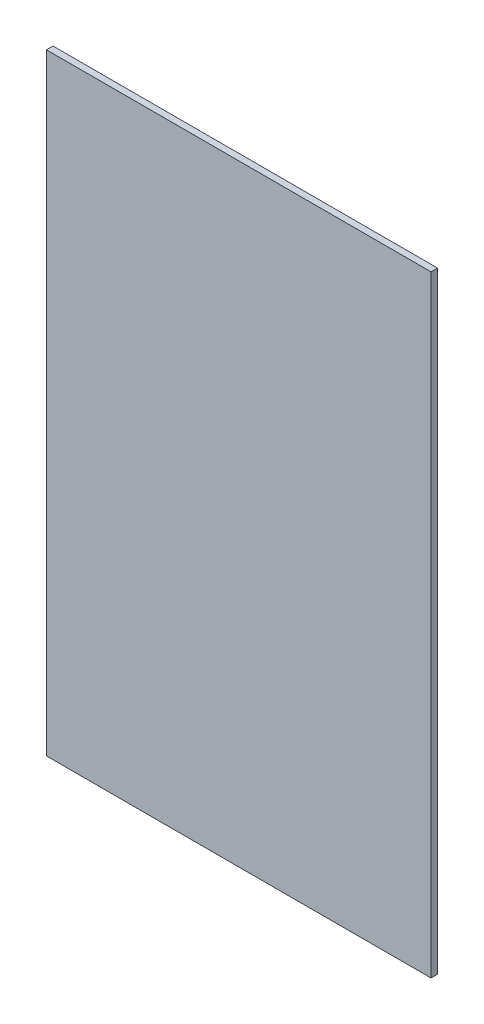
ISO-10303-21;
HEADER;
FILE_DESCRIPTION(('STEP AP214'),'2;1');
FILE_NAME('part.step','',(''),(''),'','','');
FILE_SCHEMA(('AUTOMOTIVE_DESIGN { 1 0 10303 214 1 1 1 1 }'));
ENDSEC;
DATA;
#1=APPLICATION_CONTEXT('core data for automotive mechanical design processes');
#2=APPLICATION_PROTOCOL_DEFINITION('international standard','automotive_design',2000,#1);
#3=PRODUCT_CONTEXT('',#1,'mechanical');
#4=PRODUCT('Part','Part','',(#3));
#5=PRODUCT_RELATED_PRODUCT_CATEGORY('part','',(#4));
#6=PRODUCT_DEFINITION_FORMATION('','',#4);
#7=PRODUCT_DEFINITION_CONTEXT('part definition',#1,'design');
#8=PRODUCT_DEFINITION('design','',#6,#7);
#9=PRODUCT_DEFINITION_SHAPE('','',#8);
#10=(LENGTH_UNIT() NAMED_UNIT(*) SI_UNIT(.MILLI.,.METRE.));
#11=(NAMED_UNIT(*) PLANE_ANGLE_UNIT() SI_UNIT($,.RADIAN.));
#12=(NAMED_UNIT(*) SI_UNIT($,.STERADIAN.) SOLID_ANGLE_UNIT());
#13=UNCERTAINTY_MEASURE_WITH_UNIT(LENGTH_MEASURE(1.E-05),#10,'distance_accuracy_value','');
#14=(GEOMETRIC_REPRESENTATION_CONTEXT(3) GLOBAL_UNCERTAINTY_ASSIGNED_CONTEXT((#13)) GLOBAL_UNIT_ASSIGNED_CONTEXT((#10,
#11,#12)) REPRESENTATION_CONTEXT('',''));
#15=CARTESIAN_POINT('',(0.,0.,0.));
#16=DIRECTION('',(0.,0.,1.));
#17=DIRECTION('',(1.,0.,0.));
#18=AXIS2_PLACEMENT_3D('',#15,#16,#17);
#19=CARTESIAN_POINT('',(-99.899186737332,-60.7822000000056,2.54));
#20=DIRECTION('',(1.,0.,0.));
#21=DIRECTION('',(0.,1.,0.));
#22=AXIS2_PLACEMENT_3D('',#19,#20,#21);
#23=PLANE('',#22);
#24=DIRECTION('',(0.,-1.,0.));
#25=VECTOR('',#24,1.);
#26=CARTESIAN_POINT('',(-99.899186737332,-60.7822000000056,0.));
#27=LINE('',#26,#25);
#28=CARTESIAN_POINT('',(-99.899186737332,-60.7822000000056,0.));
#29=VERTEX_POINT('',#28);
#30=CARTESIAN_POINT('',(-99.899186737332,-297.865800000011,0.));
#31=VERTEX_POINT('',#30);
#32=EDGE_CURVE('E102',#29,#31,#27,.T.);
#33=ORIENTED_EDGE('',*,*,#32,.T.);
#34=DIRECTION('',(0.,0.,-1.));
#35=VECTOR('',#34,1.);
#36=CARTESIAN_POINT('',(-99.899186737332,-297.865800000011,2.54));
#37=LINE('',#36,#35);
#38=CARTESIAN_POINT('',(-99.899186737332,-297.865800000011,2.54));
#39=VERTEX_POINT('',#38);
#40=EDGE_CURVE('E11',#39,#31,#37,.T.);
#41=ORIENTED_EDGE('',*,*,#40,.F.);
#42=DIRECTION('',(0.,-1.,0.));
#43=VECTOR('',#42,1.);
#44=CARTESIAN_POINT('',(-99.899186737332,-60.7822000000056,2.54));
#45=LINE('',#44,#43);
#46=CARTESIAN_POINT('',(-99.899186737332,-60.7822000000056,2.54));
#47=VERTEX_POINT('',#46);
#48=EDGE_CURVE('E90',#47,#39,#45,.T.);
#49=ORIENTED_EDGE('',*,*,#48,.F.);
#50=DIRECTION('',(0.,0.,-1.));
#51=VECTOR('',#50,1.);
#52=CARTESIAN_POINT('',(-99.899186737332,-60.7822000000056,2.54));
#53=LINE('',#52,#51);
#54=EDGE_CURVE('E98',#47,#29,#53,.T.);
#55=ORIENTED_EDGE('',*,*,#54,.T.);
#56=EDGE_LOOP('',(#33,#41,#49,#55));
#57=FACE_BOUND('',#56,.T.);
#58=ADVANCED_FACE('F39',(#57),#23,.F.);
#59=CARTESIAN_POINT('',(-99.899186737332,-297.865800000011,2.54));
#60=DIRECTION('',(0.,1.,0.));
#61=DIRECTION('',(0.,0.,1.));
#62=AXIS2_PLACEMENT_3D('',#59,#60,#61);
#63=PLANE('',#62);
#64=DIRECTION('',(1.,0.,0.));
#65=VECTOR('',#64,1.);
#66=CARTESIAN_POINT('',(-99.899186737332,-297.865800000011,0.));
#67=LINE('',#66,#65);
#68=CARTESIAN_POINT('',(49.2125000000101,-297.865800000011,0.));
#69=VERTEX_POINT('',#68);
#70=EDGE_CURVE('E94',#31,#69,#67,.T.);
#71=ORIENTED_EDGE('',*,*,#70,.T.);
#72=DIRECTION('',(0.,0.,-1.));
#73=VECTOR('',#72,1.);
#74=CARTESIAN_POINT('',(49.2125000000101,-297.865800000011,2.54));
#75=LINE('',#74,#73);
#76=CARTESIAN_POINT('',(49.2125000000101,-297.865800000011,2.54));
#77=VERTEX_POINT('',#76);
#78=EDGE_CURVE('E47',#77,#69,#75,.T.);
#79=ORIENTED_EDGE('',*,*,#78,.F.);
#80=DIRECTION('',(1.,0.,0.));
#81=VECTOR('',#80,1.);
#82=CARTESIAN_POINT('',(-99.899186737332,-297.865800000011,2.54));
#83=LINE('',#82,#81);
#84=EDGE_CURVE('E85',#39,#77,#83,.T.);
#85=ORIENTED_EDGE('',*,*,#84,.F.);
#86=ORIENTED_EDGE('',*,*,#40,.T.);
#87=EDGE_LOOP('',(#71,#79,#85,#86));
#88=FACE_BOUND('',#87,.T.);
#89=ADVANCED_FACE('F93',(#88),#63,.F.);
#90=CARTESIAN_POINT('',(49.2125000000101,-60.7822000000056,2.54));
#91=DIRECTION('',(-1.,0.,0.));
#92=DIRECTION('',(0.,-1.,0.));
#93=AXIS2_PLACEMENT_3D('',#90,#91,#92);
#94=PLANE('',#93);
#95=DIRECTION('',(0.,1.,0.));
#96=VECTOR('',#95,1.);
#97=CARTESIAN_POINT('',(49.2125000000101,-60.7822000000056,0.));
#98=LINE('',#97,#96);
#99=CARTESIAN_POINT('',(49.2125000000101,-60.7822000000056,0.));
#100=VERTEX_POINT('',#99);
#101=EDGE_CURVE('E72',#69,#100,#98,.T.);
#102=ORIENTED_EDGE('',*,*,#101,.T.);
#103=DIRECTION('',(0.,0.,-1.));
#104=VECTOR('',#103,1.);
#105=CARTESIAN_POINT('',(49.2125000000101,-60.7822000000056,2.54));
#106=LINE('',#105,#104);
#107=CARTESIAN_POINT('',(49.2125000000101,-60.7822000000056,2.54));
#108=VERTEX_POINT('',#107);
#109=EDGE_CURVE('E95',#108,#100,#106,.T.);
#110=ORIENTED_EDGE('',*,*,#109,.F.);
#111=DIRECTION('',(0.,1.,0.));
#112=VECTOR('',#111,1.);
#113=CARTESIAN_POINT('',(49.2125000000101,-60.7822000000056,2.54));
#114=LINE('',#113,#112);
#115=EDGE_CURVE('E88',#77,#108,#114,.T.);
#116=ORIENTED_EDGE('',*,*,#115,.F.);
#117=ORIENTED_EDGE('',*,*,#78,.T.);
#118=EDGE_LOOP('',(#102,#110,#116,#117));
#119=FACE_BOUND('',#118,.T.);
#120=ADVANCED_FACE('F96',(#119),#94,.F.);
#121=CARTESIAN_POINT('',(-99.899186737332,-60.7822000000056,2.54));
#122=DIRECTION('',(0.,-1.,0.));
#123=DIRECTION('',(0.,0.,-1.));
#124=AXIS2_PLACEMENT_3D('',#121,#122,#123);
#125=PLANE('',#124);
#126=DIRECTION('',(-1.,0.,0.));
#127=VECTOR('',#126,1.);
#128=CARTESIAN_POINT('',(-99.899186737332,-60.7822000000056,0.));
#129=LINE('',#128,#127);
#130=EDGE_CURVE('E78',#100,#29,#129,.T.);
#131=ORIENTED_EDGE('',*,*,#130,.T.);
#132=ORIENTED_EDGE('',*,*,#54,.F.);
#133=DIRECTION('',(-1.,0.,0.));
#134=VECTOR('',#133,1.);
#135=CARTESIAN_POINT('',(-99.899186737332,-60.7822000000056,2.54));
#136=LINE('',#135,#134);
#137=EDGE_CURVE('E55',#108,#47,#136,.T.);
#138=ORIENTED_EDGE('',*,*,#137,.F.);
#139=ORIENTED_EDGE('',*,*,#109,.T.);
#140=EDGE_LOOP('',(#131,#132,#138,#139));
#141=FACE_BOUND('',#140,.T.);
#142=ADVANCED_FACE('F109',(#141),#125,.F.);
#143=CARTESIAN_POINT('',(0.,0.,2.54));
#144=DIRECTION('',(0.,0.,1.));
#145=DIRECTION('',(1.,0.,0.));
#146=AXIS2_PLACEMENT_3D('',#143,#144,#145);
#147=PLANE('',#146);
#148=ORIENTED_EDGE('',*,*,#48,.T.);
#149=ORIENTED_EDGE('',*,*,#84,.T.);
#150=ORIENTED_EDGE('',*,*,#115,.T.);
#151=ORIENTED_EDGE('',*,*,#137,.T.);
#152=EDGE_LOOP('',(#148,#149,#150,#151));
#153=FACE_BOUND('',#152,.T.);
#154=ADVANCED_FACE('F86',(#153),#147,.T.);
#155=CARTESIAN_POINT('',(0.,0.,0.));
#156=DIRECTION('',(0.,0.,1.));
#157=DIRECTION('',(1.,0.,0.));
#158=AXIS2_PLACEMENT_3D('',#155,#156,#157);
#159=PLANE('',#158);
#160=ORIENTED_EDGE('',*,*,#32,.F.);
#161=ORIENTED_EDGE('',*,*,#130,.F.);
#162=ORIENTED_EDGE('',*,*,#101,.F.);
#163=ORIENTED_EDGE('',*,*,#70,.F.);
#164=EDGE_LOOP('',(#160,#161,#162,#163));
#165=FACE_BOUND('',#164,.T.);
#166=ADVANCED_FACE('F112',(#165),#159,.F.);
#167=CLOSED_SHELL('',(#58,#89,#120,#142,#154,#166));
#168=MANIFOLD_SOLID_BREP('B2',#167);
#169=ADVANCED_BREP_SHAPE_REPRESENTATION('',(#18,#168),#14);
#170=SHAPE_DEFINITION_REPRESENTATION(#9,#169);
ENDSEC;
END-ISO-10303-21;
